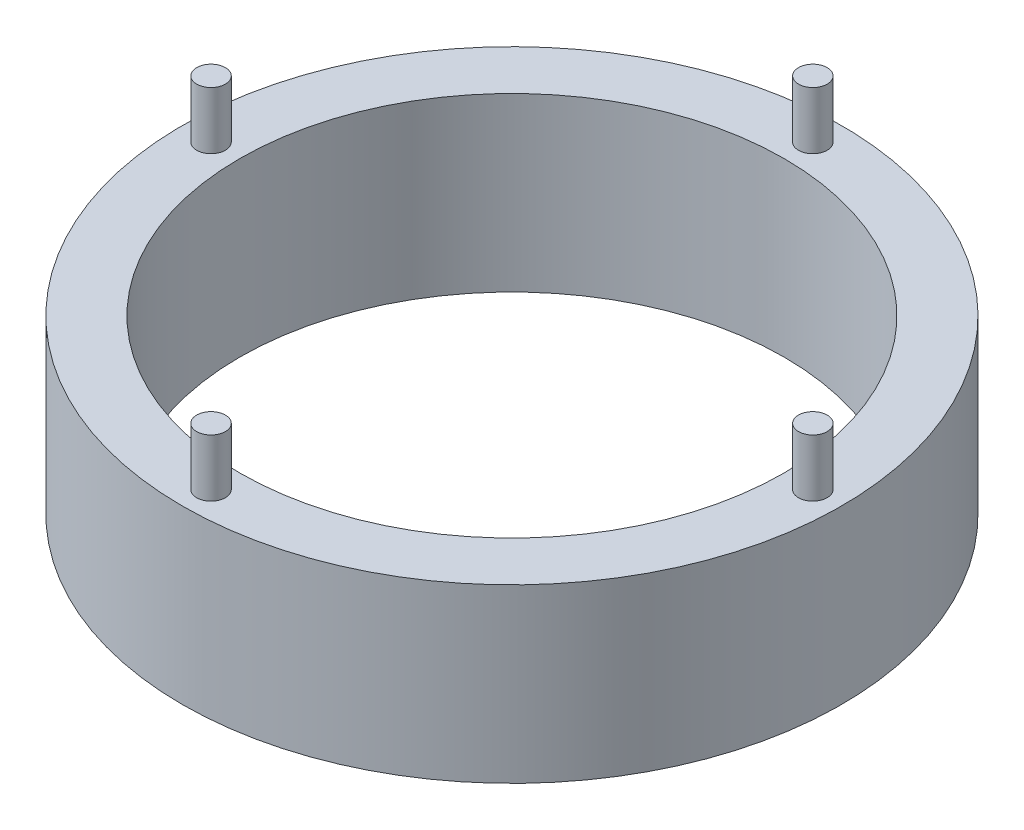
ISO-10303-21;
HEADER;
FILE_DESCRIPTION(('STEP AP214'),'2;1');
FILE_NAME('part.step','',(''),(''),'','','');
FILE_SCHEMA(('AUTOMOTIVE_DESIGN { 1 0 10303 214 1 1 1 1 }'));
ENDSEC;
DATA;
#1=APPLICATION_CONTEXT('core data for automotive mechanical design processes');
#2=APPLICATION_PROTOCOL_DEFINITION('international standard','automotive_design',2000,#1);
#3=PRODUCT_CONTEXT('',#1,'mechanical');
#4=PRODUCT('Part','Part','',(#3));
#5=PRODUCT_RELATED_PRODUCT_CATEGORY('part','',(#4));
#6=PRODUCT_DEFINITION_FORMATION('','',#4);
#7=PRODUCT_DEFINITION_CONTEXT('part definition',#1,'design');
#8=PRODUCT_DEFINITION('design','',#6,#7);
#9=PRODUCT_DEFINITION_SHAPE('','',#8);
#10=(LENGTH_UNIT() NAMED_UNIT(*) SI_UNIT(.MILLI.,.METRE.));
#11=(NAMED_UNIT(*) PLANE_ANGLE_UNIT() SI_UNIT($,.RADIAN.));
#12=(NAMED_UNIT(*) SI_UNIT($,.STERADIAN.) SOLID_ANGLE_UNIT());
#13=UNCERTAINTY_MEASURE_WITH_UNIT(LENGTH_MEASURE(1.E-05),#10,'distance_accuracy_value','');
#14=(GEOMETRIC_REPRESENTATION_CONTEXT(3) GLOBAL_UNCERTAINTY_ASSIGNED_CONTEXT((#13)) GLOBAL_UNIT_ASSIGNED_CONTEXT((#10,
#11,#12)) REPRESENTATION_CONTEXT('',''));
#15=CARTESIAN_POINT('',(0.,0.,0.));
#16=DIRECTION('',(0.,0.,1.));
#17=DIRECTION('',(1.,0.,0.));
#18=AXIS2_PLACEMENT_3D('',#15,#16,#17);
#19=CARTESIAN_POINT('',(0.,0.,0.));
#20=DIRECTION('',(0.,1.,0.));
#21=DIRECTION('',(0.,0.,1.));
#22=AXIS2_PLACEMENT_3D('',#19,#20,#21);
#23=PLANE('',#22);
#24=CARTESIAN_POINT('',(0.,0.,-52.5));
#25=DIRECTION('',(0.,1.,0.));
#26=DIRECTION('',(0.,0.,1.));
#27=AXIS2_PLACEMENT_3D('',#24,#25,#26);
#28=CIRCLE('',#27,2.5);
#29=CARTESIAN_POINT('',(0.,0.,-55.));
#30=VERTEX_POINT('',#29);
#31=EDGE_CURVE('E88',#30,#30,#28,.T.);
#32=ORIENTED_EDGE('',*,*,#31,.T.);
#33=EDGE_LOOP('',(#32));
#34=FACE_BOUND('',#33,.T.);
#35=CARTESIAN_POINT('',(52.5,0.,0.));
#36=DIRECTION('',(0.,1.,0.));
#37=DIRECTION('',(0.,0.,1.));
#38=AXIS2_PLACEMENT_3D('',#35,#36,#37);
#39=CIRCLE('',#38,2.5);
#40=CARTESIAN_POINT('',(52.5,0.,-2.5));
#41=VERTEX_POINT('',#40);
#42=EDGE_CURVE('E82',#41,#41,#39,.T.);
#43=ORIENTED_EDGE('',*,*,#42,.T.);
#44=EDGE_LOOP('',(#43));
#45=FACE_BOUND('',#44,.T.);
#46=CARTESIAN_POINT('',(0.,0.,0.));
#47=DIRECTION('',(0.,1.,0.));
#48=DIRECTION('',(0.,0.,1.));
#49=AXIS2_PLACEMENT_3D('',#46,#47,#48);
#50=CIRCLE('',#49,57.5);
#51=CARTESIAN_POINT('',(0.,0.,57.5));
#52=VERTEX_POINT('',#51);
#53=EDGE_CURVE('E43',#52,#52,#50,.T.);
#54=ORIENTED_EDGE('',*,*,#53,.F.);
#55=EDGE_LOOP('',(#54));
#56=FACE_BOUND('',#55,.T.);
#57=CARTESIAN_POINT('',(0.,0.,0.));
#58=DIRECTION('',(0.,1.,0.));
#59=DIRECTION('',(0.,0.,1.));
#60=AXIS2_PLACEMENT_3D('',#57,#58,#59);
#61=CIRCLE('',#60,47.5);
#62=CARTESIAN_POINT('',(0.,0.,47.5));
#63=VERTEX_POINT('',#62);
#64=EDGE_CURVE('E52',#63,#63,#61,.T.);
#65=ORIENTED_EDGE('',*,*,#64,.T.);
#66=EDGE_LOOP('',(#65));
#67=FACE_BOUND('',#66,.T.);
#68=CARTESIAN_POINT('',(-52.5,0.,0.));
#69=DIRECTION('',(0.,1.,0.));
#70=DIRECTION('',(0.,0.,1.));
#71=AXIS2_PLACEMENT_3D('',#68,#69,#70);
#72=CIRCLE('',#71,2.5);
#73=CARTESIAN_POINT('',(-52.5,0.,2.5));
#74=VERTEX_POINT('',#73);
#75=EDGE_CURVE('E94',#74,#74,#72,.T.);
#76=ORIENTED_EDGE('',*,*,#75,.T.);
#77=EDGE_LOOP('',(#76));
#78=FACE_BOUND('',#77,.T.);
#79=CARTESIAN_POINT('',(0.,0.,52.5));
#80=DIRECTION('',(0.,1.,0.));
#81=DIRECTION('',(0.,0.,1.));
#82=AXIS2_PLACEMENT_3D('',#79,#80,#81);
#83=CIRCLE('',#82,2.5);
#84=CARTESIAN_POINT('',(0.,0.,55.));
#85=VERTEX_POINT('',#84);
#86=EDGE_CURVE('E100',#85,#85,#83,.T.);
#87=ORIENTED_EDGE('',*,*,#86,.T.);
#88=EDGE_LOOP('',(#87));
#89=FACE_BOUND('',#88,.T.);
#90=ADVANCED_FACE('F39',(#34,#45,#56,#67,#78,#89),#23,.F.);
#91=CARTESIAN_POINT('',(0.,30.,0.));
#92=DIRECTION('',(0.,1.,0.));
#93=DIRECTION('',(0.,0.,1.));
#94=AXIS2_PLACEMENT_3D('',#91,#92,#93);
#95=PLANE('',#94);
#96=CARTESIAN_POINT('',(52.5,30.,0.));
#97=DIRECTION('',(0.,1.,0.));
#98=DIRECTION('',(0.,0.,1.));
#99=AXIS2_PLACEMENT_3D('',#96,#97,#98);
#100=CIRCLE('',#99,2.5);
#101=CARTESIAN_POINT('',(52.5,30.,2.5));
#102=VERTEX_POINT('',#101);
#103=EDGE_CURVE('E75',#102,#102,#100,.F.);
#104=ORIENTED_EDGE('',*,*,#103,.T.);
#105=EDGE_LOOP('',(#104));
#106=FACE_BOUND('',#105,.T.);
#107=CARTESIAN_POINT('',(0.,30.,-52.5));
#108=DIRECTION('',(0.,1.,0.));
#109=DIRECTION('',(0.,0.,1.));
#110=AXIS2_PLACEMENT_3D('',#107,#108,#109);
#111=CIRCLE('',#110,2.5);
#112=CARTESIAN_POINT('',(0.,30.,-50.));
#113=VERTEX_POINT('',#112);
#114=EDGE_CURVE('E69',#113,#113,#111,.F.);
#115=ORIENTED_EDGE('',*,*,#114,.T.);
#116=EDGE_LOOP('',(#115));
#117=FACE_BOUND('',#116,.T.);
#118=CARTESIAN_POINT('',(-52.5,30.,0.));
#119=DIRECTION('',(0.,1.,0.));
#120=DIRECTION('',(0.,0.,1.));
#121=AXIS2_PLACEMENT_3D('',#118,#119,#120);
#122=CIRCLE('',#121,2.5);
#123=CARTESIAN_POINT('',(-52.5,30.,2.5));
#124=VERTEX_POINT('',#123);
#125=EDGE_CURVE('E63',#124,#124,#122,.F.);
#126=ORIENTED_EDGE('',*,*,#125,.T.);
#127=EDGE_LOOP('',(#126));
#128=FACE_BOUND('',#127,.T.);
#129=CARTESIAN_POINT('',(0.,30.,52.5));
#130=DIRECTION('',(0.,1.,0.));
#131=DIRECTION('',(0.,0.,1.));
#132=AXIS2_PLACEMENT_3D('',#129,#130,#131);
#133=CIRCLE('',#132,2.5);
#134=CARTESIAN_POINT('',(0.,30.,55.));
#135=VERTEX_POINT('',#134);
#136=EDGE_CURVE('E55',#135,#135,#133,.F.);
#137=ORIENTED_EDGE('',*,*,#136,.T.);
#138=EDGE_LOOP('',(#137));
#139=FACE_BOUND('',#138,.T.);
#140=CARTESIAN_POINT('',(0.,30.,0.));
#141=DIRECTION('',(0.,1.,0.));
#142=DIRECTION('',(0.,0.,1.));
#143=AXIS2_PLACEMENT_3D('',#140,#141,#142);
#144=CIRCLE('',#143,57.5);
#145=CARTESIAN_POINT('',(0.,30.,57.5));
#146=VERTEX_POINT('',#145);
#147=EDGE_CURVE('E10',#146,#146,#144,.T.);
#148=ORIENTED_EDGE('',*,*,#147,.T.);
#149=EDGE_LOOP('',(#148));
#150=FACE_BOUND('',#149,.T.);
#151=CARTESIAN_POINT('',(0.,30.,0.));
#152=DIRECTION('',(0.,1.,0.));
#153=DIRECTION('',(0.,0.,1.));
#154=AXIS2_PLACEMENT_3D('',#151,#152,#153);
#155=CIRCLE('',#154,47.5);
#156=CARTESIAN_POINT('',(0.,30.,47.5));
#157=VERTEX_POINT('',#156);
#158=EDGE_CURVE('E50',#157,#157,#155,.T.);
#159=ORIENTED_EDGE('',*,*,#158,.F.);
#160=EDGE_LOOP('',(#159));
#161=FACE_BOUND('',#160,.T.);
#162=ADVANCED_FACE('F118',(#106,#117,#128,#139,#150,#161),#95,.T.);
#163=CARTESIAN_POINT('',(0.,30.,0.));
#164=DIRECTION('',(0.,-1.,0.));
#165=DIRECTION('',(0.,0.,-1.));
#166=AXIS2_PLACEMENT_3D('',#163,#164,#165);
#167=CYLINDRICAL_SURFACE('',#166,57.5);
#168=ORIENTED_EDGE('',*,*,#147,.F.);
#169=EDGE_LOOP('',(#168));
#170=FACE_BOUND('',#169,.T.);
#171=ORIENTED_EDGE('',*,*,#53,.T.);
#172=EDGE_LOOP('',(#171));
#173=FACE_BOUND('',#172,.T.);
#174=ADVANCED_FACE('F41',(#170,#173),#167,.T.);
#175=CARTESIAN_POINT('',(0.,30.,0.));
#176=DIRECTION('',(0.,-1.,0.));
#177=DIRECTION('',(0.,0.,-1.));
#178=AXIS2_PLACEMENT_3D('',#175,#176,#177);
#179=CYLINDRICAL_SURFACE('',#178,47.5);
#180=ORIENTED_EDGE('',*,*,#158,.T.);
#181=EDGE_LOOP('',(#180));
#182=FACE_BOUND('',#181,.T.);
#183=ORIENTED_EDGE('',*,*,#64,.F.);
#184=EDGE_LOOP('',(#183));
#185=FACE_BOUND('',#184,.T.);
#186=ADVANCED_FACE('F127',(#182,#185),#179,.F.);
#187=CARTESIAN_POINT('',(0.,40.,52.5));
#188=DIRECTION('',(0.,-1.,0.));
#189=DIRECTION('',(0.,0.,-1.));
#190=AXIS2_PLACEMENT_3D('',#187,#188,#189);
#191=CYLINDRICAL_SURFACE('',#190,2.5);
#192=ORIENTED_EDGE('',*,*,#136,.F.);
#193=EDGE_LOOP('',(#192));
#194=FACE_BOUND('',#193,.T.);
#195=CARTESIAN_POINT('',(0.,40.,52.5));
#196=DIRECTION('',(0.,1.,0.));
#197=DIRECTION('',(0.,0.,1.));
#198=AXIS2_PLACEMENT_3D('',#195,#196,#197);
#199=CIRCLE('',#198,2.5);
#200=CARTESIAN_POINT('',(0.,40.,55.));
#201=VERTEX_POINT('',#200);
#202=EDGE_CURVE('E60',#201,#201,#199,.T.);
#203=ORIENTED_EDGE('',*,*,#202,.F.);
#204=EDGE_LOOP('',(#203));
#205=FACE_BOUND('',#204,.T.);
#206=ADVANCED_FACE('F130',(#194,#205),#191,.T.);
#207=CARTESIAN_POINT('',(0.,40.,52.5));
#208=DIRECTION('',(0.,1.,0.));
#209=DIRECTION('',(0.,0.,1.));
#210=AXIS2_PLACEMENT_3D('',#207,#208,#209);
#211=PLANE('',#210);
#212=ORIENTED_EDGE('',*,*,#202,.T.);
#213=EDGE_LOOP('',(#212));
#214=FACE_BOUND('',#213,.T.);
#215=ADVANCED_FACE('F134',(#214),#211,.T.);
#216=CARTESIAN_POINT('',(-52.5,40.,0.));
#217=DIRECTION('',(0.,-1.,0.));
#218=DIRECTION('',(0.,0.,-1.));
#219=AXIS2_PLACEMENT_3D('',#216,#217,#218);
#220=CYLINDRICAL_SURFACE('',#219,2.5);
#221=ORIENTED_EDGE('',*,*,#125,.F.);
#222=EDGE_LOOP('',(#221));
#223=FACE_BOUND('',#222,.T.);
#224=CARTESIAN_POINT('',(-52.5,40.,0.));
#225=DIRECTION('',(0.,1.,0.));
#226=DIRECTION('',(0.,0.,1.));
#227=AXIS2_PLACEMENT_3D('',#224,#225,#226);
#228=CIRCLE('',#227,2.5);
#229=CARTESIAN_POINT('',(-52.5,40.,2.5));
#230=VERTEX_POINT('',#229);
#231=EDGE_CURVE('E66',#230,#230,#228,.T.);
#232=ORIENTED_EDGE('',*,*,#231,.F.);
#233=EDGE_LOOP('',(#232));
#234=FACE_BOUND('',#233,.T.);
#235=ADVANCED_FACE('F138',(#223,#234),#220,.T.);
#236=CARTESIAN_POINT('',(-52.5,40.,0.));
#237=DIRECTION('',(0.,1.,0.));
#238=DIRECTION('',(0.,0.,1.));
#239=AXIS2_PLACEMENT_3D('',#236,#237,#238);
#240=PLANE('',#239);
#241=ORIENTED_EDGE('',*,*,#231,.T.);
#242=EDGE_LOOP('',(#241));
#243=FACE_BOUND('',#242,.T.);
#244=ADVANCED_FACE('F140',(#243),#240,.T.);
#245=CARTESIAN_POINT('',(0.,40.,-52.5));
#246=DIRECTION('',(0.,-1.,0.));
#247=DIRECTION('',(0.,0.,-1.));
#248=AXIS2_PLACEMENT_3D('',#245,#246,#247);
#249=CYLINDRICAL_SURFACE('',#248,2.5);
#250=ORIENTED_EDGE('',*,*,#114,.F.);
#251=EDGE_LOOP('',(#250));
#252=FACE_BOUND('',#251,.T.);
#253=CARTESIAN_POINT('',(0.,40.,-52.5));
#254=DIRECTION('',(0.,1.,0.));
#255=DIRECTION('',(0.,0.,1.));
#256=AXIS2_PLACEMENT_3D('',#253,#254,#255);
#257=CIRCLE('',#256,2.5);
#258=CARTESIAN_POINT('',(0.,40.,-50.));
#259=VERTEX_POINT('',#258);
#260=EDGE_CURVE('E72',#259,#259,#257,.T.);
#261=ORIENTED_EDGE('',*,*,#260,.F.);
#262=EDGE_LOOP('',(#261));
#263=FACE_BOUND('',#262,.T.);
#264=ADVANCED_FACE('F143',(#252,#263),#249,.T.);
#265=CARTESIAN_POINT('',(0.,40.,-52.5));
#266=DIRECTION('',(0.,1.,0.));
#267=DIRECTION('',(0.,0.,1.));
#268=AXIS2_PLACEMENT_3D('',#265,#266,#267);
#269=PLANE('',#268);
#270=ORIENTED_EDGE('',*,*,#260,.T.);
#271=EDGE_LOOP('',(#270));
#272=FACE_BOUND('',#271,.T.);
#273=ADVANCED_FACE('F148',(#272),#269,.T.);
#274=CARTESIAN_POINT('',(52.5,40.,0.));
#275=DIRECTION('',(0.,-1.,0.));
#276=DIRECTION('',(0.,0.,-1.));
#277=AXIS2_PLACEMENT_3D('',#274,#275,#276);
#278=CYLINDRICAL_SURFACE('',#277,2.5);
#279=ORIENTED_EDGE('',*,*,#103,.F.);
#280=EDGE_LOOP('',(#279));
#281=FACE_BOUND('',#280,.T.);
#282=CARTESIAN_POINT('',(52.5,40.,0.));
#283=DIRECTION('',(0.,1.,0.));
#284=DIRECTION('',(0.,0.,1.));
#285=AXIS2_PLACEMENT_3D('',#282,#283,#284);
#286=CIRCLE('',#285,2.5);
#287=CARTESIAN_POINT('',(52.5,40.,2.5));
#288=VERTEX_POINT('',#287);
#289=EDGE_CURVE('E78',#288,#288,#286,.T.);
#290=ORIENTED_EDGE('',*,*,#289,.F.);
#291=EDGE_LOOP('',(#290));
#292=FACE_BOUND('',#291,.T.);
#293=ADVANCED_FACE('F151',(#281,#292),#278,.T.);
#294=CARTESIAN_POINT('',(52.5,40.,0.));
#295=DIRECTION('',(0.,1.,0.));
#296=DIRECTION('',(0.,0.,1.));
#297=AXIS2_PLACEMENT_3D('',#294,#295,#296);
#298=PLANE('',#297);
#299=ORIENTED_EDGE('',*,*,#289,.T.);
#300=EDGE_LOOP('',(#299));
#301=FACE_BOUND('',#300,.T.);
#302=ADVANCED_FACE('F156',(#301),#298,.T.);
#303=CARTESIAN_POINT('',(52.5,9.99999999999999,0.));
#304=DIRECTION('',(0.,-1.,0.));
#305=DIRECTION('',(0.,0.,-1.));
#306=AXIS2_PLACEMENT_3D('',#303,#304,#305);
#307=CYLINDRICAL_SURFACE('',#306,2.5);
#308=CARTESIAN_POINT('',(52.5,9.99999999999999,0.));
#309=DIRECTION('',(0.,1.,0.));
#310=DIRECTION('',(0.,0.,1.));
#311=AXIS2_PLACEMENT_3D('',#308,#309,#310);
#312=CIRCLE('',#311,2.5);
#313=CARTESIAN_POINT('',(52.5,9.99999999999999,-2.5));
#314=VERTEX_POINT('',#313);
#315=EDGE_CURVE('E81',#314,#314,#312,.T.);
#316=CARTESIAN_POINT('',(52.5,9.99999999999999,-2.5));
#317=CARTESIAN_POINT('',(52.5,9.89583333333332,-2.5));
#318=CARTESIAN_POINT('',(52.5,9.79166666666665,-2.5));
#319=CARTESIAN_POINT('',(52.5,9.58333333333332,-2.5));
#320=CARTESIAN_POINT('',(52.5,9.47916666666666,-2.5));
#321=CARTESIAN_POINT('',(52.5,9.27083333333332,-2.5));
#322=CARTESIAN_POINT('',(52.5,9.16666666666666,-2.5));
#323=CARTESIAN_POINT('',(52.5,8.95833333333332,-2.5));
#324=CARTESIAN_POINT('',(52.5,8.85416666666666,-2.5));
#325=CARTESIAN_POINT('',(52.5,8.64583333333332,-2.5));
#326=CARTESIAN_POINT('',(52.5,8.54166666666666,-2.5));
#327=CARTESIAN_POINT('',(52.5,8.33333333333332,-2.5));
#328=CARTESIAN_POINT('',(52.5,8.22916666666666,-2.5));
#329=CARTESIAN_POINT('',(52.5,8.02083333333332,-2.5));
#330=CARTESIAN_POINT('',(52.5,7.91666666666666,-2.5));
#331=CARTESIAN_POINT('',(52.5,7.70833333333332,-2.5));
#332=CARTESIAN_POINT('',(52.5,7.60416666666666,-2.5));
#333=CARTESIAN_POINT('',(52.5,7.39583333333332,-2.5));
#334=CARTESIAN_POINT('',(52.5,7.29166666666666,-2.5));
#335=CARTESIAN_POINT('',(52.5,7.08333333333332,-2.5));
#336=CARTESIAN_POINT('',(52.5,6.97916666666666,-2.5));
#337=CARTESIAN_POINT('',(52.5,6.77083333333332,-2.5));
#338=CARTESIAN_POINT('',(52.5,6.66666666666666,-2.5));
#339=CARTESIAN_POINT('',(52.5,6.45833333333333,-2.5));
#340=CARTESIAN_POINT('',(52.5,6.35416666666666,-2.5));
#341=CARTESIAN_POINT('',(52.5,6.14583333333333,-2.5));
#342=CARTESIAN_POINT('',(52.5,6.04166666666666,-2.5));
#343=CARTESIAN_POINT('',(52.5,5.83333333333333,-2.5));
#344=CARTESIAN_POINT('',(52.5,5.72916666666666,-2.5));
#345=CARTESIAN_POINT('',(52.5,5.52083333333333,-2.5));
#346=CARTESIAN_POINT('',(52.5,5.41666666666666,-2.5));
#347=CARTESIAN_POINT('',(52.5,5.20833333333333,-2.5));
#348=CARTESIAN_POINT('',(52.5,5.10416666666666,-2.5));
#349=CARTESIAN_POINT('',(52.5,4.89583333333333,-2.5));
#350=CARTESIAN_POINT('',(52.5,4.79166666666666,-2.5));
#351=CARTESIAN_POINT('',(52.5,4.58333333333333,-2.5));
#352=CARTESIAN_POINT('',(52.5,4.47916666666666,-2.5));
#353=CARTESIAN_POINT('',(52.5,4.27083333333333,-2.5));
#354=CARTESIAN_POINT('',(52.5,4.16666666666666,-2.5));
#355=CARTESIAN_POINT('',(52.5,3.95833333333333,-2.5));
#356=CARTESIAN_POINT('',(52.5,3.85416666666666,-2.5));
#357=CARTESIAN_POINT('',(52.5,3.64583333333333,-2.5));
#358=CARTESIAN_POINT('',(52.5,3.54166666666666,-2.5));
#359=CARTESIAN_POINT('',(52.5,3.33333333333333,-2.5));
#360=CARTESIAN_POINT('',(52.5,3.22916666666666,-2.5));
#361=CARTESIAN_POINT('',(52.5,3.02083333333333,-2.5));
#362=CARTESIAN_POINT('',(52.5,2.91666666666666,-2.5));
#363=CARTESIAN_POINT('',(52.5,2.70833333333333,-2.5));
#364=CARTESIAN_POINT('',(52.5,2.60416666666666,-2.5));
#365=CARTESIAN_POINT('',(52.5,2.39583333333333,-2.5));
#366=CARTESIAN_POINT('',(52.5,2.29166666666666,-2.5));
#367=CARTESIAN_POINT('',(52.5,2.08333333333333,-2.5));
#368=CARTESIAN_POINT('',(52.5,1.97916666666666,-2.5));
#369=CARTESIAN_POINT('',(52.5,1.77083333333333,-2.5));
#370=CARTESIAN_POINT('',(52.5,1.66666666666666,-2.5));
#371=CARTESIAN_POINT('',(52.5,1.45833333333333,-2.5));
#372=CARTESIAN_POINT('',(52.5,1.35416666666666,-2.5));
#373=CARTESIAN_POINT('',(52.5,1.14583333333333,-2.5));
#374=CARTESIAN_POINT('',(52.5,1.04166666666666,-2.5));
#375=CARTESIAN_POINT('',(52.5,0.833333333333331,-2.5));
#376=CARTESIAN_POINT('',(52.5,0.729166666666664,-2.5));
#377=CARTESIAN_POINT('',(52.5,0.520833333333331,-2.5));
#378=CARTESIAN_POINT('',(52.5,0.416666666666665,-2.5));
#379=CARTESIAN_POINT('',(52.5,0.208333333333332,-2.5));
#380=CARTESIAN_POINT('',(52.5,0.104166666666665,-2.5));
#381=CARTESIAN_POINT('',(52.5,0.,-2.5));
#382=B_SPLINE_CURVE_WITH_KNOTS('',3,(#316,#317,#318,#319,#320,#321,#322,#323,#324,#325,#326,
#327,#328,#329,#330,#331,#332,#333,#334,#335,#336,#337,#338,#339,#340,#341,#342,#343,#344,#345,
#346,#347,#348,#349,#350,#351,#352,#353,#354,#355,#356,#357,#358,#359,#360,#361,#362,#363,#364,
#365,#366,#367,#368,#369,#370,#371,#372,#373,#374,#375,#376,#377,#378,#379,#380,#381),
.UNSPECIFIED.,.F.,.F.,(4,2,2,2,2,2,2,2,2,2,2,2,2,2,2,2,2,2,2,2,2,2,2,2,2,2,2,2,2,2,2,2,4),(0.,
0.312499999999999,0.624999999999999,0.937499999999997,1.25,1.5625,1.875,2.1875,2.5,2.8125,3.125,
3.4375,3.74999999999999,4.06249999999999,4.37499999999999,4.68749999999999,4.99999999999999,
5.31249999999999,5.62499999999999,5.93749999999999,6.24999999999999,6.56249999999999,
6.87499999999999,7.18749999999999,7.49999999999999,7.81249999999999,8.12499999999999,
8.43749999999999,8.74999999999999,9.06249999999999,9.37499999999999,9.68749999999999,
9.99999999999999),.UNSPECIFIED.);
#383=EDGE_CURVE('BSEAM159',#314,#41,#382,.T.);
#384=ORIENTED_EDGE('',*,*,#315,.T.);
#385=ORIENTED_EDGE('',*,*,#42,.F.);
#386=ORIENTED_EDGE('',*,*,#383,.T.);
#387=ORIENTED_EDGE('',*,*,#383,.F.);
#388=EDGE_LOOP('',(#384,#386,#385,#387));
#389=FACE_BOUND('',#388,.T.);
#390=ADVANCED_FACE('F159',(#389),#307,.F.);
#391=CARTESIAN_POINT('',(52.5,9.99999999999999,0.));
#392=DIRECTION('',(0.,1.,0.));
#393=DIRECTION('',(0.,0.,1.));
#394=AXIS2_PLACEMENT_3D('',#391,#392,#393);
#395=PLANE('',#394);
#396=ORIENTED_EDGE('',*,*,#315,.F.);
#397=EDGE_LOOP('',(#396));
#398=FACE_BOUND('',#397,.T.);
#399=ADVANCED_FACE('F166',(#398),#395,.F.);
#400=CARTESIAN_POINT('',(0.,9.99999999999999,-52.5));
#401=DIRECTION('',(0.,-1.,0.));
#402=DIRECTION('',(0.,0.,-1.));
#403=AXIS2_PLACEMENT_3D('',#400,#401,#402);
#404=CYLINDRICAL_SURFACE('',#403,2.5);
#405=CARTESIAN_POINT('',(0.,9.99999999999999,-52.5));
#406=DIRECTION('',(0.,1.,0.));
#407=DIRECTION('',(0.,0.,1.));
#408=AXIS2_PLACEMENT_3D('',#405,#406,#407);
#409=CIRCLE('',#408,2.5);
#410=CARTESIAN_POINT('',(0.,9.99999999999999,-55.));
#411=VERTEX_POINT('',#410);
#412=EDGE_CURVE('E85',#411,#411,#409,.T.);
#413=CARTESIAN_POINT('',(0.,9.99999999999999,-55.));
#414=CARTESIAN_POINT('',(0.,9.89583333333332,-55.));
#415=CARTESIAN_POINT('',(0.,9.79166666666665,-55.));
#416=CARTESIAN_POINT('',(0.,9.58333333333332,-55.));
#417=CARTESIAN_POINT('',(0.,9.47916666666666,-55.));
#418=CARTESIAN_POINT('',(0.,9.27083333333332,-55.));
#419=CARTESIAN_POINT('',(0.,9.16666666666666,-55.));
#420=CARTESIAN_POINT('',(0.,8.95833333333332,-55.));
#421=CARTESIAN_POINT('',(0.,8.85416666666666,-55.));
#422=CARTESIAN_POINT('',(0.,8.64583333333332,-55.));
#423=CARTESIAN_POINT('',(0.,8.54166666666666,-55.));
#424=CARTESIAN_POINT('',(0.,8.33333333333332,-55.));
#425=CARTESIAN_POINT('',(0.,8.22916666666666,-55.));
#426=CARTESIAN_POINT('',(0.,8.02083333333332,-55.));
#427=CARTESIAN_POINT('',(0.,7.91666666666666,-55.));
#428=CARTESIAN_POINT('',(0.,7.70833333333332,-55.));
#429=CARTESIAN_POINT('',(0.,7.60416666666666,-55.));
#430=CARTESIAN_POINT('',(0.,7.39583333333332,-55.));
#431=CARTESIAN_POINT('',(0.,7.29166666666666,-55.));
#432=CARTESIAN_POINT('',(0.,7.08333333333332,-55.));
#433=CARTESIAN_POINT('',(0.,6.97916666666666,-55.));
#434=CARTESIAN_POINT('',(0.,6.77083333333332,-55.));
#435=CARTESIAN_POINT('',(0.,6.66666666666666,-55.));
#436=CARTESIAN_POINT('',(0.,6.45833333333333,-55.));
#437=CARTESIAN_POINT('',(0.,6.35416666666666,-55.));
#438=CARTESIAN_POINT('',(0.,6.14583333333333,-55.));
#439=CARTESIAN_POINT('',(0.,6.04166666666666,-55.));
#440=CARTESIAN_POINT('',(0.,5.83333333333333,-55.));
#441=CARTESIAN_POINT('',(0.,5.72916666666666,-55.));
#442=CARTESIAN_POINT('',(0.,5.52083333333333,-55.));
#443=CARTESIAN_POINT('',(0.,5.41666666666666,-55.));
#444=CARTESIAN_POINT('',(0.,5.20833333333333,-55.));
#445=CARTESIAN_POINT('',(0.,5.10416666666666,-55.));
#446=CARTESIAN_POINT('',(0.,4.89583333333333,-55.));
#447=CARTESIAN_POINT('',(0.,4.79166666666666,-55.));
#448=CARTESIAN_POINT('',(0.,4.58333333333333,-55.));
#449=CARTESIAN_POINT('',(0.,4.47916666666666,-55.));
#450=CARTESIAN_POINT('',(0.,4.27083333333333,-55.));
#451=CARTESIAN_POINT('',(0.,4.16666666666666,-55.));
#452=CARTESIAN_POINT('',(0.,3.95833333333333,-55.));
#453=CARTESIAN_POINT('',(0.,3.85416666666666,-55.));
#454=CARTESIAN_POINT('',(0.,3.64583333333333,-55.));
#455=CARTESIAN_POINT('',(0.,3.54166666666666,-55.));
#456=CARTESIAN_POINT('',(0.,3.33333333333333,-55.));
#457=CARTESIAN_POINT('',(0.,3.22916666666666,-55.));
#458=CARTESIAN_POINT('',(0.,3.02083333333333,-55.));
#459=CARTESIAN_POINT('',(0.,2.91666666666666,-55.));
#460=CARTESIAN_POINT('',(0.,2.70833333333333,-55.));
#461=CARTESIAN_POINT('',(0.,2.60416666666666,-55.));
#462=CARTESIAN_POINT('',(0.,2.39583333333333,-55.));
#463=CARTESIAN_POINT('',(0.,2.29166666666666,-55.));
#464=CARTESIAN_POINT('',(0.,2.08333333333333,-55.));
#465=CARTESIAN_POINT('',(0.,1.97916666666666,-55.));
#466=CARTESIAN_POINT('',(0.,1.77083333333333,-55.));
#467=CARTESIAN_POINT('',(0.,1.66666666666666,-55.));
#468=CARTESIAN_POINT('',(0.,1.45833333333333,-55.));
#469=CARTESIAN_POINT('',(0.,1.35416666666666,-55.));
#470=CARTESIAN_POINT('',(0.,1.14583333333333,-55.));
#471=CARTESIAN_POINT('',(0.,1.04166666666666,-55.));
#472=CARTESIAN_POINT('',(0.,0.833333333333331,-55.));
#473=CARTESIAN_POINT('',(0.,0.729166666666664,-55.));
#474=CARTESIAN_POINT('',(0.,0.520833333333331,-55.));
#475=CARTESIAN_POINT('',(0.,0.416666666666665,-55.));
#476=CARTESIAN_POINT('',(0.,0.208333333333332,-55.));
#477=CARTESIAN_POINT('',(0.,0.104166666666665,-55.));
#478=CARTESIAN_POINT('',(0.,0.,-55.));
#479=B_SPLINE_CURVE_WITH_KNOTS('',3,(#413,#414,#415,#416,#417,#418,#419,#420,#421,#422,#423,
#424,#425,#426,#427,#428,#429,#430,#431,#432,#433,#434,#435,#436,#437,#438,#439,#440,#441,#442,
#443,#444,#445,#446,#447,#448,#449,#450,#451,#452,#453,#454,#455,#456,#457,#458,#459,#460,#461,
#462,#463,#464,#465,#466,#467,#468,#469,#470,#471,#472,#473,#474,#475,#476,#477,#478),
.UNSPECIFIED.,.F.,.F.,(4,2,2,2,2,2,2,2,2,2,2,2,2,2,2,2,2,2,2,2,2,2,2,2,2,2,2,2,2,2,2,2,4),(0.,
0.312499999999999,0.624999999999999,0.937499999999997,1.25,1.5625,1.875,2.1875,2.5,2.8125,3.125,
3.4375,3.74999999999999,4.06249999999999,4.37499999999999,4.68749999999999,4.99999999999999,
5.31249999999999,5.62499999999999,5.93749999999999,6.24999999999999,6.56249999999999,
6.87499999999999,7.18749999999999,7.49999999999999,7.81249999999999,8.12499999999999,
8.43749999999999,8.74999999999999,9.06249999999999,9.37499999999999,9.68749999999999,
9.99999999999999),.UNSPECIFIED.);
#480=EDGE_CURVE('BSEAM170',#411,#30,#479,.T.);
#481=ORIENTED_EDGE('',*,*,#412,.T.);
#482=ORIENTED_EDGE('',*,*,#31,.F.);
#483=ORIENTED_EDGE('',*,*,#480,.T.);
#484=ORIENTED_EDGE('',*,*,#480,.F.);
#485=EDGE_LOOP('',(#481,#483,#482,#484));
#486=FACE_BOUND('',#485,.T.);
#487=ADVANCED_FACE('F170',(#486),#404,.F.);
#488=CARTESIAN_POINT('',(0.,9.99999999999999,-52.5));
#489=DIRECTION('',(0.,1.,0.));
#490=DIRECTION('',(0.,0.,1.));
#491=AXIS2_PLACEMENT_3D('',#488,#489,#490);
#492=PLANE('',#491);
#493=ORIENTED_EDGE('',*,*,#412,.F.);
#494=EDGE_LOOP('',(#493));
#495=FACE_BOUND('',#494,.T.);
#496=ADVANCED_FACE('F174',(#495),#492,.F.);
#497=CARTESIAN_POINT('',(-52.5,9.99999999999998,0.));
#498=DIRECTION('',(0.,-1.,0.));
#499=DIRECTION('',(0.,0.,-1.));
#500=AXIS2_PLACEMENT_3D('',#497,#498,#499);
#501=CYLINDRICAL_SURFACE('',#500,2.5);
#502=CARTESIAN_POINT('',(-52.5,9.99999999999998,0.));
#503=DIRECTION('',(0.,1.,0.));
#504=DIRECTION('',(0.,0.,1.));
#505=AXIS2_PLACEMENT_3D('',#502,#503,#504);
#506=CIRCLE('',#505,2.5);
#507=CARTESIAN_POINT('',(-52.5,9.99999999999998,2.5));
#508=VERTEX_POINT('',#507);
#509=EDGE_CURVE('E97',#508,#508,#506,.T.);
#510=ORIENTED_EDGE('',*,*,#509,.T.);
#511=EDGE_LOOP('',(#510));
#512=FACE_BOUND('',#511,.T.);
#513=ORIENTED_EDGE('',*,*,#75,.F.);
#514=EDGE_LOOP('',(#513));
#515=FACE_BOUND('',#514,.T.);
#516=ADVANCED_FACE('F178',(#512,#515),#501,.F.);
#517=CARTESIAN_POINT('',(-52.5,9.99999999999998,0.));
#518=DIRECTION('',(0.,1.,0.));
#519=DIRECTION('',(0.,0.,1.));
#520=AXIS2_PLACEMENT_3D('',#517,#518,#519);
#521=PLANE('',#520);
#522=ORIENTED_EDGE('',*,*,#509,.F.);
#523=EDGE_LOOP('',(#522));
#524=FACE_BOUND('',#523,.T.);
#525=ADVANCED_FACE('F115',(#524),#521,.F.);
#526=CARTESIAN_POINT('',(0.,9.99999999999998,52.5));
#527=DIRECTION('',(0.,-1.,0.));
#528=DIRECTION('',(0.,0.,-1.));
#529=AXIS2_PLACEMENT_3D('',#526,#527,#528);
#530=CYLINDRICAL_SURFACE('',#529,2.5);
#531=CARTESIAN_POINT('',(0.,9.99999999999998,52.5));
#532=DIRECTION('',(0.,1.,0.));
#533=DIRECTION('',(0.,0.,1.));
#534=AXIS2_PLACEMENT_3D('',#531,#532,#533);
#535=CIRCLE('',#534,2.5);
#536=CARTESIAN_POINT('',(0.,9.99999999999998,55.));
#537=VERTEX_POINT('',#536);
#538=EDGE_CURVE('E91',#537,#537,#535,.T.);
#539=ORIENTED_EDGE('',*,*,#538,.T.);
#540=EDGE_LOOP('',(#539));
#541=FACE_BOUND('',#540,.T.);
#542=ORIENTED_EDGE('',*,*,#86,.F.);
#543=EDGE_LOOP('',(#542));
#544=FACE_BOUND('',#543,.T.);
#545=ADVANCED_FACE('F106',(#541,#544),#530,.F.);
#546=CARTESIAN_POINT('',(0.,9.99999999999998,52.5));
#547=DIRECTION('',(0.,1.,0.));
#548=DIRECTION('',(0.,0.,1.));
#549=AXIS2_PLACEMENT_3D('',#546,#547,#548);
#550=PLANE('',#549);
#551=ORIENTED_EDGE('',*,*,#538,.F.);
#552=EDGE_LOOP('',(#551));
#553=FACE_BOUND('',#552,.T.);
#554=ADVANCED_FACE('F109',(#553),#550,.F.);
#555=CLOSED_SHELL('',(#90,#162,#174,#186,#206,#215,#235,#244,#264,#273,#293,#302,#390,#399,#487,
#496,#516,#525,#545,#554));
#556=MANIFOLD_SOLID_BREP('B2',#555);
#557=ADVANCED_BREP_SHAPE_REPRESENTATION('',(#18,#556),#14);
#558=SHAPE_DEFINITION_REPRESENTATION(#9,#557);
ENDSEC;
END-ISO-10303-21;
